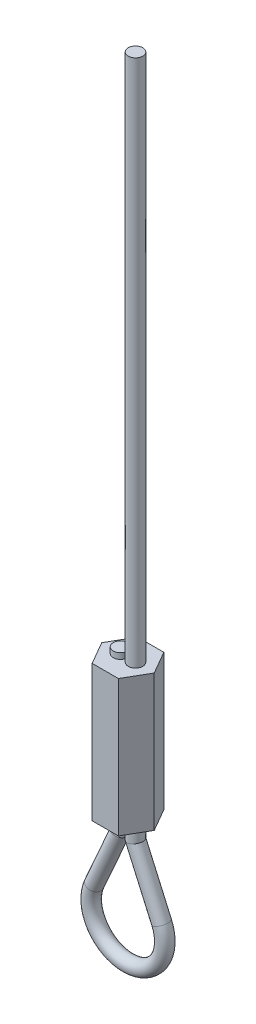
ISO-10303-21;
HEADER;
FILE_DESCRIPTION(('STEP AP214'),'2;1');
FILE_NAME('part.step','',(''),(''),'','','');
FILE_SCHEMA(('AUTOMOTIVE_DESIGN { 1 0 10303 214 1 1 1 1 }'));
ENDSEC;
DATA;
#1=APPLICATION_CONTEXT('core data for automotive mechanical design processes');
#2=APPLICATION_PROTOCOL_DEFINITION('international standard','automotive_design',2000,#1);
#3=PRODUCT_CONTEXT('',#1,'mechanical');
#4=PRODUCT('Part','Part','',(#3));
#5=PRODUCT_RELATED_PRODUCT_CATEGORY('part','',(#4));
#6=PRODUCT_DEFINITION_FORMATION('','',#4);
#7=PRODUCT_DEFINITION_CONTEXT('part definition',#1,'design');
#8=PRODUCT_DEFINITION('design','',#6,#7);
#9=PRODUCT_DEFINITION_SHAPE('','',#8);
#10=(LENGTH_UNIT() NAMED_UNIT(*) SI_UNIT(.MILLI.,.METRE.));
#11=(NAMED_UNIT(*) PLANE_ANGLE_UNIT() SI_UNIT($,.RADIAN.));
#12=(NAMED_UNIT(*) SI_UNIT($,.STERADIAN.) SOLID_ANGLE_UNIT());
#13=UNCERTAINTY_MEASURE_WITH_UNIT(LENGTH_MEASURE(1.E-05),#10,'distance_accuracy_value','');
#14=(GEOMETRIC_REPRESENTATION_CONTEXT(3) GLOBAL_UNCERTAINTY_ASSIGNED_CONTEXT((#13)) GLOBAL_UNIT_ASSIGNED_CONTEXT((#10,
#11,#12)) REPRESENTATION_CONTEXT('',''));
#15=CARTESIAN_POINT('',(0.,0.,0.));
#16=DIRECTION('',(0.,0.,1.));
#17=DIRECTION('',(1.,0.,0.));
#18=AXIS2_PLACEMENT_3D('',#15,#16,#17);
#19=CARTESIAN_POINT('',(-1.65,16.2750060991939,0.));
#20=DIRECTION('',(0.,1.,0.));
#21=DIRECTION('',(-1.,0.,0.));
#22=AXIS2_PLACEMENT_3D('',#19,#20,#21);
#23=CYLINDRICAL_SURFACE('',#22,1.6);
#24=CARTESIAN_POINT('',(-1.65,16.2750060991939,0.));
#25=DIRECTION('',(0.206982264042947,0.978344695070023,0.));
#26=DIRECTION('',(0.978344695070023,-0.206982264042947,0.));
#27=AXIS2_PLACEMENT_3D('',#24,#25,#26);
#28=ELLIPSE('',#27,1.63541541959859,1.6);
#29=CARTESIAN_POINT('',(-0.0499999999999993,15.9365041129946,0.));
#30=VERTEX_POINT('',#29);
#31=EDGE_CURVE('E160',#30,#30,#28,.T.);
#32=ORIENTED_EDGE('',*,*,#31,.T.);
#33=EDGE_LOOP('',(#32));
#34=FACE_BOUND('',#33,.T.);
#35=CARTESIAN_POINT('',(-1.65,20.,0.));
#36=DIRECTION('',(0.,1.,0.));
#37=DIRECTION('',(0.,0.,1.));
#38=AXIS2_PLACEMENT_3D('',#35,#36,#37);
#39=CIRCLE('',#38,1.6);
#40=CARTESIAN_POINT('',(-1.65,20.,1.6));
#41=VERTEX_POINT('',#40);
#42=EDGE_CURVE('E145',#41,#41,#39,.F.);
#43=ORIENTED_EDGE('',*,*,#42,.T.);
#44=EDGE_LOOP('',(#43));
#45=FACE_BOUND('',#44,.T.);
#46=ADVANCED_FACE('F37',(#34,#45),#23,.T.);
#47=CARTESIAN_POINT('',(1.65,11.7495226996,0.));
#48=DIRECTION('',(0.,1.,0.));
#49=DIRECTION('',(-1.,0.,0.));
#50=AXIS2_PLACEMENT_3D('',#47,#48,#49);
#51=CYLINDRICAL_SURFACE('',#50,1.6);
#52=CARTESIAN_POINT('',(1.65,16.2750060991939,0.));
#53=DIRECTION('',(0.206982264042947,-0.978344695070023,0.));
#54=DIRECTION('',(0.978344695070023,0.206982264042947,0.));
#55=AXIS2_PLACEMENT_3D('',#52,#53,#54);
#56=ELLIPSE('',#55,1.63541541959859,1.6);
#57=CARTESIAN_POINT('',(3.25,16.6135080853932,0.));
#58=VERTEX_POINT('',#57);
#59=EDGE_CURVE('E151',#58,#58,#56,.T.);
#60=ORIENTED_EDGE('',*,*,#59,.F.);
#61=EDGE_LOOP('',(#60));
#62=FACE_BOUND('',#61,.T.);
#63=CARTESIAN_POINT('',(1.65,20.,0.));
#64=DIRECTION('',(0.,1.,0.));
#65=DIRECTION('',(0.,0.,1.));
#66=AXIS2_PLACEMENT_3D('',#63,#64,#65);
#67=CIRCLE('',#66,1.6);
#68=CARTESIAN_POINT('',(1.65,20.,1.6));
#69=VERTEX_POINT('',#68);
#70=EDGE_CURVE('E47',#69,#69,#67,.T.);
#71=ORIENTED_EDGE('',*,*,#70,.F.);
#72=EDGE_LOOP('',(#71));
#73=FACE_BOUND('',#72,.T.);
#74=ADVANCED_FACE('F170',(#62,#73),#51,.T.);
#75=CARTESIAN_POINT('',(-7.40596514642078,3.28050000000009,0.));
#76=DIRECTION('',(0.405,0.914316684743312,0.));
#77=DIRECTION('',(-0.914316684743312,0.405,0.));
#78=AXIS2_PLACEMENT_3D('',#75,#76,#77);
#79=CYLINDRICAL_SURFACE('',#78,1.6);
#80=CARTESIAN_POINT('',(-7.40596514642078,3.28050000000009,0.));
#81=DIRECTION('',(0.405000000000011,0.914316684743306,0.));
#82=DIRECTION('',(-0.914316684743307,0.405000000000011,0.));
#83=AXIS2_PLACEMENT_3D('',#80,#81,#82);
#84=CIRCLE('',#83,1.6);
#85=CARTESIAN_POINT('',(-8.86887184201007,3.92850000000011,0.));
#86=VERTEX_POINT('',#85);
#87=EDGE_CURVE('E157',#86,#86,#84,.F.);
#88=ORIENTED_EDGE('',*,*,#87,.F.);
#89=EDGE_LOOP('',(#88));
#90=FACE_BOUND('',#89,.T.);
#91=ORIENTED_EDGE('',*,*,#31,.F.);
#92=EDGE_LOOP('',(#91));
#93=FACE_BOUND('',#92,.T.);
#94=ADVANCED_FACE('F172',(#90,#93),#79,.T.);
#95=CARTESIAN_POINT('',(0.,0.,0.));
#96=DIRECTION('',(0.,0.,-1.));
#97=DIRECTION('',(-1.,0.,0.));
#98=AXIS2_PLACEMENT_3D('',#95,#96,#97);
#99=TOROIDAL_SURFACE('',#98,8.1,1.6);
#100=CARTESIAN_POINT('',(7.40596514642082,3.28049999999999,0.));
#101=DIRECTION('',(0.405,-0.914316684743312,0.));
#102=DIRECTION('',(0.914316684743312,0.405,0.));
#103=AXIS2_PLACEMENT_3D('',#100,#101,#102);
#104=CIRCLE('',#103,1.6);
#105=CARTESIAN_POINT('',(8.86887184201013,3.92849999999999,0.));
#106=VERTEX_POINT('',#105);
#107=EDGE_CURVE('E154',#106,#106,#104,.F.);
#108=CARTESIAN_POINT('',(0.,0.,0.));
#109=DIRECTION('',(0.,0.,-1.));
#110=DIRECTION('',(-1.,0.,0.));
#111=AXIS2_PLACEMENT_3D('',#108,#109,#110);
#112=CIRCLE('',#111,9.7);
#113=EDGE_CURVE('',#106,#86,#112,.T.);
#114=ORIENTED_EDGE('',*,*,#107,.F.);
#115=ORIENTED_EDGE('',*,*,#87,.T.);
#116=ORIENTED_EDGE('',*,*,#113,.T.);
#117=ORIENTED_EDGE('',*,*,#113,.F.);
#118=EDGE_LOOP('',(#114,#116,#115,#117));
#119=FACE_BOUND('',#118,.T.);
#120=ADVANCED_FACE('F180',(#119),#99,.T.);
#121=CARTESIAN_POINT('',(1.65,16.2750060991939,0.));
#122=DIRECTION('',(0.405,-0.914316684743312,0.));
#123=DIRECTION('',(0.914316684743312,0.405,0.));
#124=AXIS2_PLACEMENT_3D('',#121,#122,#123);
#125=CYLINDRICAL_SURFACE('',#124,1.6);
#126=ORIENTED_EDGE('',*,*,#59,.T.);
#127=EDGE_LOOP('',(#126));
#128=FACE_BOUND('',#127,.T.);
#129=ORIENTED_EDGE('',*,*,#107,.T.);
#130=EDGE_LOOP('',(#129));
#131=FACE_BOUND('',#130,.T.);
#132=ADVANCED_FACE('F203',(#128,#131),#125,.T.);
#133=CARTESIAN_POINT('',(8.66025403784438,50.,-5.));
#134=DIRECTION('',(0.,1.,0.));
#135=DIRECTION('',(0.,0.,1.));
#136=AXIS2_PLACEMENT_3D('',#133,#134,#135);
#137=PLANE('',#136);
#138=CARTESIAN_POINT('',(-1.65,50.,0.));
#139=DIRECTION('',(0.,1.,0.));
#140=DIRECTION('',(0.,0.,1.));
#141=AXIS2_PLACEMENT_3D('',#138,#139,#140);
#142=CIRCLE('',#141,1.6);
#143=CARTESIAN_POINT('',(-1.65,50.,1.6));
#144=VERTEX_POINT('',#143);
#145=EDGE_CURVE('E12',#144,#144,#142,.F.);
#146=ORIENTED_EDGE('',*,*,#145,.T.);
#147=EDGE_LOOP('',(#146));
#148=FACE_BOUND('',#147,.T.);
#149=DIRECTION('',(0.5,0.,-0.866025403784439));
#150=VECTOR('',#149,1.);
#151=CARTESIAN_POINT('',(2.88675134594813,50.,5.));
#152=LINE('',#151,#150);
#153=CARTESIAN_POINT('',(2.88675134594813,50.,5.));
#154=VERTEX_POINT('',#153);
#155=CARTESIAN_POINT('',(5.77350269189626,50.,0.));
#156=VERTEX_POINT('',#155);
#157=EDGE_CURVE('E136',#154,#156,#152,.T.);
#158=ORIENTED_EDGE('',*,*,#157,.T.);
#159=DIRECTION('',(-0.5,0.,-0.866025403784439));
#160=VECTOR('',#159,1.);
#161=CARTESIAN_POINT('',(5.77350269189626,50.,0.));
#162=LINE('',#161,#160);
#163=CARTESIAN_POINT('',(2.88675134594813,50.,-5.));
#164=VERTEX_POINT('',#163);
#165=EDGE_CURVE('E94',#156,#164,#162,.T.);
#166=ORIENTED_EDGE('',*,*,#165,.T.);
#167=DIRECTION('',(-1.,0.,0.));
#168=VECTOR('',#167,1.);
#169=CARTESIAN_POINT('',(2.88675134594813,50.,-5.));
#170=LINE('',#169,#168);
#171=CARTESIAN_POINT('',(-2.88675134594813,50.,-5.));
#172=VERTEX_POINT('',#171);
#173=EDGE_CURVE('E108',#164,#172,#170,.T.);
#174=ORIENTED_EDGE('',*,*,#173,.T.);
#175=DIRECTION('',(-0.5,0.,0.866025403784439));
#176=VECTOR('',#175,1.);
#177=CARTESIAN_POINT('',(-2.88675134594813,50.,-5.));
#178=LINE('',#177,#176);
#179=CARTESIAN_POINT('',(-5.77350269189626,50.,0.));
#180=VERTEX_POINT('',#179);
#181=EDGE_CURVE('E101',#172,#180,#178,.T.);
#182=ORIENTED_EDGE('',*,*,#181,.T.);
#183=DIRECTION('',(0.5,0.,0.866025403784439));
#184=VECTOR('',#183,1.);
#185=CARTESIAN_POINT('',(-5.77350269189626,50.,0.));
#186=LINE('',#185,#184);
#187=CARTESIAN_POINT('',(-2.88675134594813,50.,5.));
#188=VERTEX_POINT('',#187);
#189=EDGE_CURVE('E106',#180,#188,#186,.T.);
#190=ORIENTED_EDGE('',*,*,#189,.T.);
#191=DIRECTION('',(1.,0.,0.));
#192=VECTOR('',#191,1.);
#193=CARTESIAN_POINT('',(-2.88675134594813,50.,5.));
#194=LINE('',#193,#192);
#195=EDGE_CURVE('E56',#188,#154,#194,.T.);
#196=ORIENTED_EDGE('',*,*,#195,.T.);
#197=EDGE_LOOP('',(#158,#166,#174,#182,#190,#196));
#198=FACE_BOUND('',#197,.T.);
#199=CARTESIAN_POINT('',(1.65,50.,0.));
#200=DIRECTION('',(0.,1.,0.));
#201=DIRECTION('',(0.,0.,1.));
#202=AXIS2_PLACEMENT_3D('',#199,#200,#201);
#203=CIRCLE('',#202,1.6);
#204=CARTESIAN_POINT('',(1.65,50.,1.6));
#205=VERTEX_POINT('',#204);
#206=EDGE_CURVE('E41',#205,#205,#203,.T.);
#207=ORIENTED_EDGE('',*,*,#206,.F.);
#208=EDGE_LOOP('',(#207));
#209=FACE_BOUND('',#208,.T.);
#210=ADVANCED_FACE('F103',(#148,#198,#209),#137,.T.);
#211=CARTESIAN_POINT('',(8.66025403784438,20.,-5.));
#212=DIRECTION('',(0.,1.,0.));
#213=DIRECTION('',(0.,0.,1.));
#214=AXIS2_PLACEMENT_3D('',#211,#212,#213);
#215=PLANE('',#214);
#216=ORIENTED_EDGE('',*,*,#42,.F.);
#217=EDGE_LOOP('',(#216));
#218=FACE_BOUND('',#217,.T.);
#219=DIRECTION('',(0.5,0.,-0.866025403784439));
#220=VECTOR('',#219,1.);
#221=CARTESIAN_POINT('',(2.88675134594813,20.,5.));
#222=LINE('',#221,#220);
#223=CARTESIAN_POINT('',(2.88675134594813,20.,5.));
#224=VERTEX_POINT('',#223);
#225=CARTESIAN_POINT('',(5.77350269189626,20.,0.));
#226=VERTEX_POINT('',#225);
#227=EDGE_CURVE('E126',#224,#226,#222,.T.);
#228=ORIENTED_EDGE('',*,*,#227,.F.);
#229=DIRECTION('',(1.,0.,0.));
#230=VECTOR('',#229,1.);
#231=CARTESIAN_POINT('',(-2.88675134594813,20.,5.));
#232=LINE('',#231,#230);
#233=CARTESIAN_POINT('',(-2.88675134594813,20.,5.));
#234=VERTEX_POINT('',#233);
#235=EDGE_CURVE('E85',#234,#224,#232,.T.);
#236=ORIENTED_EDGE('',*,*,#235,.F.);
#237=DIRECTION('',(0.5,0.,0.866025403784439));
#238=VECTOR('',#237,1.);
#239=CARTESIAN_POINT('',(-5.77350269189626,20.,0.));
#240=LINE('',#239,#238);
#241=CARTESIAN_POINT('',(-5.77350269189626,20.,0.));
#242=VERTEX_POINT('',#241);
#243=EDGE_CURVE('E79',#242,#234,#240,.T.);
#244=ORIENTED_EDGE('',*,*,#243,.F.);
#245=DIRECTION('',(-0.5,0.,0.866025403784439));
#246=VECTOR('',#245,1.);
#247=CARTESIAN_POINT('',(-2.88675134594813,20.,-5.));
#248=LINE('',#247,#246);
#249=CARTESIAN_POINT('',(-2.88675134594813,20.,-5.));
#250=VERTEX_POINT('',#249);
#251=EDGE_CURVE('E116',#250,#242,#248,.T.);
#252=ORIENTED_EDGE('',*,*,#251,.F.);
#253=DIRECTION('',(-1.,0.,0.));
#254=VECTOR('',#253,1.);
#255=CARTESIAN_POINT('',(2.88675134594813,20.,-5.));
#256=LINE('',#255,#254);
#257=CARTESIAN_POINT('',(2.88675134594813,20.,-5.));
#258=VERTEX_POINT('',#257);
#259=EDGE_CURVE('E131',#258,#250,#256,.T.);
#260=ORIENTED_EDGE('',*,*,#259,.F.);
#261=DIRECTION('',(-0.5,0.,-0.866025403784439));
#262=VECTOR('',#261,1.);
#263=CARTESIAN_POINT('',(5.77350269189626,20.,0.));
#264=LINE('',#263,#262);
#265=EDGE_CURVE('E129',#226,#258,#264,.T.);
#266=ORIENTED_EDGE('',*,*,#265,.F.);
#267=EDGE_LOOP('',(#228,#236,#244,#252,#260,#266));
#268=FACE_BOUND('',#267,.T.);
#269=ORIENTED_EDGE('',*,*,#70,.T.);
#270=EDGE_LOOP('',(#269));
#271=FACE_BOUND('',#270,.T.);
#272=ADVANCED_FACE('F168',(#218,#268,#271),#215,.F.);
#273=CARTESIAN_POINT('',(2.88675134594813,50.,5.));
#274=DIRECTION('',(-0.866025403784439,0.,-0.5));
#275=DIRECTION('',(-0.5,0.,0.866025403784439));
#276=AXIS2_PLACEMENT_3D('',#273,#274,#275);
#277=PLANE('',#276);
#278=ORIENTED_EDGE('',*,*,#227,.T.);
#279=DIRECTION('',(0.,-1.,0.));
#280=VECTOR('',#279,1.);
#281=CARTESIAN_POINT('',(5.77350269189626,50.,0.));
#282=LINE('',#281,#280);
#283=EDGE_CURVE('E143',#156,#226,#282,.T.);
#284=ORIENTED_EDGE('',*,*,#283,.F.);
#285=ORIENTED_EDGE('',*,*,#157,.F.);
#286=DIRECTION('',(0.,-1.,0.));
#287=VECTOR('',#286,1.);
#288=CARTESIAN_POINT('',(2.88675134594813,50.,5.));
#289=LINE('',#288,#287);
#290=EDGE_CURVE('E122',#154,#224,#289,.T.);
#291=ORIENTED_EDGE('',*,*,#290,.T.);
#292=EDGE_LOOP('',(#278,#284,#285,#291));
#293=FACE_BOUND('',#292,.T.);
#294=ADVANCED_FACE('F210',(#293),#277,.F.);
#295=CARTESIAN_POINT('',(5.77350269189626,50.,0.));
#296=DIRECTION('',(-0.866025403784438,0.,0.5));
#297=DIRECTION('',(0.5,0.,0.866025403784439));
#298=AXIS2_PLACEMENT_3D('',#295,#296,#297);
#299=PLANE('',#298);
#300=ORIENTED_EDGE('',*,*,#265,.T.);
#301=DIRECTION('',(0.,-1.,0.));
#302=VECTOR('',#301,1.);
#303=CARTESIAN_POINT('',(2.88675134594813,50.,-5.));
#304=LINE('',#303,#302);
#305=EDGE_CURVE('E140',#164,#258,#304,.T.);
#306=ORIENTED_EDGE('',*,*,#305,.F.);
#307=ORIENTED_EDGE('',*,*,#165,.F.);
#308=ORIENTED_EDGE('',*,*,#283,.T.);
#309=EDGE_LOOP('',(#300,#306,#307,#308));
#310=FACE_BOUND('',#309,.T.);
#311=ADVANCED_FACE('F224',(#310),#299,.F.);
#312=CARTESIAN_POINT('',(2.88675134594813,50.,-5.));
#313=DIRECTION('',(0.,0.,1.));
#314=DIRECTION('',(1.,0.,0.));
#315=AXIS2_PLACEMENT_3D('',#312,#313,#314);
#316=PLANE('',#315);
#317=ORIENTED_EDGE('',*,*,#259,.T.);
#318=DIRECTION('',(0.,-1.,0.));
#319=VECTOR('',#318,1.);
#320=CARTESIAN_POINT('',(-2.88675134594813,50.,-5.));
#321=LINE('',#320,#319);
#322=EDGE_CURVE('E117',#172,#250,#321,.T.);
#323=ORIENTED_EDGE('',*,*,#322,.F.);
#324=ORIENTED_EDGE('',*,*,#173,.F.);
#325=ORIENTED_EDGE('',*,*,#305,.T.);
#326=EDGE_LOOP('',(#317,#323,#324,#325));
#327=FACE_BOUND('',#326,.T.);
#328=ADVANCED_FACE('F221',(#327),#316,.F.);
#329=CARTESIAN_POINT('',(-2.88675134594813,50.,-5.));
#330=DIRECTION('',(0.866025403784439,0.,0.5));
#331=DIRECTION('',(0.5,0.,-0.866025403784439));
#332=AXIS2_PLACEMENT_3D('',#329,#330,#331);
#333=PLANE('',#332);
#334=ORIENTED_EDGE('',*,*,#251,.T.);
#335=DIRECTION('',(0.,-1.,0.));
#336=VECTOR('',#335,1.);
#337=CARTESIAN_POINT('',(-5.77350269189626,50.,0.));
#338=LINE('',#337,#336);
#339=EDGE_CURVE('E113',#180,#242,#338,.T.);
#340=ORIENTED_EDGE('',*,*,#339,.F.);
#341=ORIENTED_EDGE('',*,*,#181,.F.);
#342=ORIENTED_EDGE('',*,*,#322,.T.);
#343=EDGE_LOOP('',(#334,#340,#341,#342));
#344=FACE_BOUND('',#343,.T.);
#345=ADVANCED_FACE('F114',(#344),#333,.F.);
#346=CARTESIAN_POINT('',(-5.77350269189626,50.,0.));
#347=DIRECTION('',(0.866025403784439,0.,-0.5));
#348=DIRECTION('',(-0.5,0.,-0.866025403784439));
#349=AXIS2_PLACEMENT_3D('',#346,#347,#348);
#350=PLANE('',#349);
#351=ORIENTED_EDGE('',*,*,#243,.T.);
#352=DIRECTION('',(0.,-1.,0.));
#353=VECTOR('',#352,1.);
#354=CARTESIAN_POINT('',(-2.88675134594813,50.,5.));
#355=LINE('',#354,#353);
#356=EDGE_CURVE('E118',#188,#234,#355,.T.);
#357=ORIENTED_EDGE('',*,*,#356,.F.);
#358=ORIENTED_EDGE('',*,*,#189,.F.);
#359=ORIENTED_EDGE('',*,*,#339,.T.);
#360=EDGE_LOOP('',(#351,#357,#358,#359));
#361=FACE_BOUND('',#360,.T.);
#362=ADVANCED_FACE('F120',(#361),#350,.F.);
#363=CARTESIAN_POINT('',(-2.88675134594813,50.,5.));
#364=DIRECTION('',(0.,0.,-1.));
#365=DIRECTION('',(-1.,0.,0.));
#366=AXIS2_PLACEMENT_3D('',#363,#364,#365);
#367=PLANE('',#366);
#368=ORIENTED_EDGE('',*,*,#235,.T.);
#369=ORIENTED_EDGE('',*,*,#290,.F.);
#370=ORIENTED_EDGE('',*,*,#195,.F.);
#371=ORIENTED_EDGE('',*,*,#356,.T.);
#372=EDGE_LOOP('',(#368,#369,#370,#371));
#373=FACE_BOUND('',#372,.T.);
#374=ADVANCED_FACE('F196',(#373),#367,.F.);
#375=CARTESIAN_POINT('',(1.64999999999998,166.275006099194,0.));
#376=DIRECTION('',(0.,-1.,0.));
#377=DIRECTION('',(1.,0.,0.));
#378=AXIS2_PLACEMENT_3D('',#375,#376,#377);
#379=PLANE('',#378);
#380=CARTESIAN_POINT('',(1.64999999999998,166.275006099194,0.));
#381=DIRECTION('',(0.,-1.,0.));
#382=DIRECTION('',(1.,0.,0.));
#383=AXIS2_PLACEMENT_3D('',#380,#381,#382);
#384=CIRCLE('',#383,1.6);
#385=CARTESIAN_POINT('',(3.24999999999998,166.275006099194,0.));
#386=VERTEX_POINT('',#385);
#387=EDGE_CURVE('E148',#386,#386,#384,.T.);
#388=ORIENTED_EDGE('',*,*,#387,.F.);
#389=EDGE_LOOP('',(#388));
#390=FACE_BOUND('',#389,.T.);
#391=ADVANCED_FACE('F188',(#390),#379,.F.);
#392=ORIENTED_EDGE('',*,*,#206,.T.);
#393=EDGE_LOOP('',(#392));
#394=FACE_BOUND('',#393,.T.);
#395=ORIENTED_EDGE('',*,*,#387,.T.);
#396=EDGE_LOOP('',(#395));
#397=FACE_BOUND('',#396,.T.);
#398=ADVANCED_FACE('F175',(#394,#397),#51,.T.);
#399=CARTESIAN_POINT('',(-1.65,51.2750060991939,0.));
#400=DIRECTION('',(0.,1.,0.));
#401=DIRECTION('',(-1.,0.,0.));
#402=AXIS2_PLACEMENT_3D('',#399,#400,#401);
#403=PLANE('',#402);
#404=CARTESIAN_POINT('',(-1.65,51.2750060991939,0.));
#405=DIRECTION('',(0.,1.,0.));
#406=DIRECTION('',(-1.,0.,0.));
#407=AXIS2_PLACEMENT_3D('',#404,#405,#406);
#408=CIRCLE('',#407,1.6);
#409=CARTESIAN_POINT('',(-3.25,51.2750060991939,0.));
#410=VERTEX_POINT('',#409);
#411=EDGE_CURVE('E163',#410,#410,#408,.F.);
#412=ORIENTED_EDGE('',*,*,#411,.F.);
#413=EDGE_LOOP('',(#412));
#414=FACE_BOUND('',#413,.T.);
#415=ADVANCED_FACE('F187',(#414),#403,.T.);
#416=ORIENTED_EDGE('',*,*,#145,.F.);
#417=EDGE_LOOP('',(#416));
#418=FACE_BOUND('',#417,.T.);
#419=ORIENTED_EDGE('',*,*,#411,.T.);
#420=EDGE_LOOP('',(#419));
#421=FACE_BOUND('',#420,.T.);
#422=ADVANCED_FACE('F39',(#418,#421),#23,.T.);
#423=CLOSED_SHELL('',(#46,#74,#94,#120,#132,#210,#272,#294,#311,#328,#345,#362,#374,#391,#398,
#415,#422));
#424=MANIFOLD_SOLID_BREP('B2',#423);
#425=ADVANCED_BREP_SHAPE_REPRESENTATION('',(#18,#424),#14);
#426=SHAPE_DEFINITION_REPRESENTATION(#9,#425);
ENDSEC;
END-ISO-10303-21;
